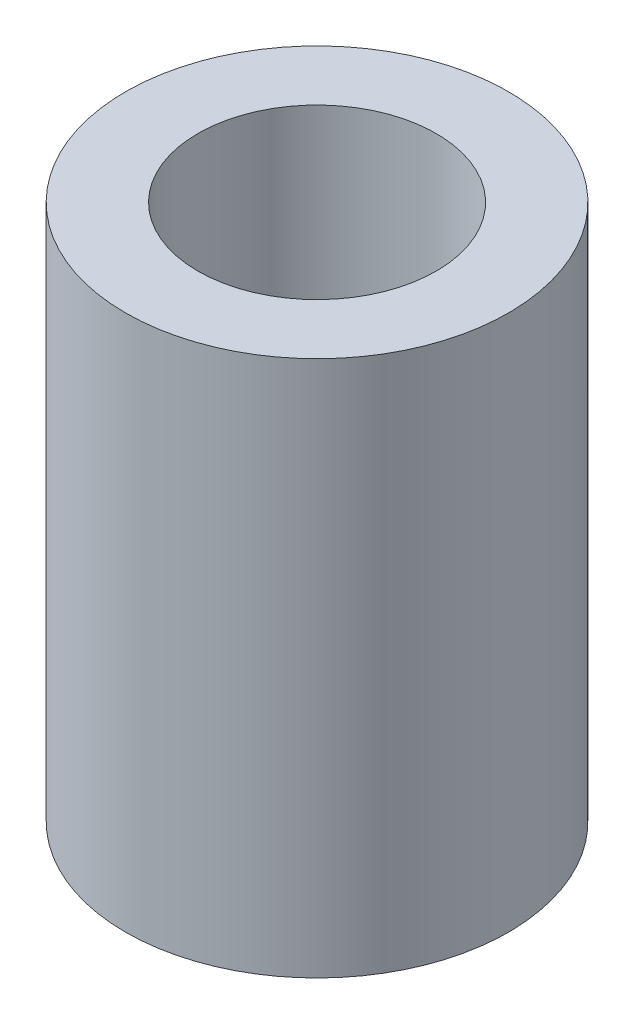
ISO-10303-21;
HEADER;
FILE_DESCRIPTION(('STEP AP214'),'2;1');
FILE_NAME('part.step','',(''),(''),'','','');
FILE_SCHEMA(('AUTOMOTIVE_DESIGN { 1 0 10303 214 1 1 1 1 }'));
ENDSEC;
DATA;
#1=APPLICATION_CONTEXT('core data for automotive mechanical design processes');
#2=APPLICATION_PROTOCOL_DEFINITION('international standard','automotive_design',2000,#1);
#3=PRODUCT_CONTEXT('',#1,'mechanical');
#4=PRODUCT('Part','Part','',(#3));
#5=PRODUCT_RELATED_PRODUCT_CATEGORY('part','',(#4));
#6=PRODUCT_DEFINITION_FORMATION('','',#4);
#7=PRODUCT_DEFINITION_CONTEXT('part definition',#1,'design');
#8=PRODUCT_DEFINITION('design','',#6,#7);
#9=PRODUCT_DEFINITION_SHAPE('','',#8);
#10=(LENGTH_UNIT() NAMED_UNIT(*) SI_UNIT(.MILLI.,.METRE.));
#11=(NAMED_UNIT(*) PLANE_ANGLE_UNIT() SI_UNIT($,.RADIAN.));
#12=(NAMED_UNIT(*) SI_UNIT($,.STERADIAN.) SOLID_ANGLE_UNIT());
#13=UNCERTAINTY_MEASURE_WITH_UNIT(LENGTH_MEASURE(1.E-05),#10,'distance_accuracy_value','');
#14=(GEOMETRIC_REPRESENTATION_CONTEXT(3) GLOBAL_UNCERTAINTY_ASSIGNED_CONTEXT((#13)) GLOBAL_UNIT_ASSIGNED_CONTEXT((#10,
#11,#12)) REPRESENTATION_CONTEXT('',''));
#15=CARTESIAN_POINT('',(0.,0.,0.));
#16=DIRECTION('',(0.,0.,1.));
#17=DIRECTION('',(1.,0.,0.));
#18=AXIS2_PLACEMENT_3D('',#15,#16,#17);
#19=CARTESIAN_POINT('',(0.,6.3,0.));
#20=DIRECTION('',(0.,-1.,0.));
#21=DIRECTION('',(0.,0.,-1.));
#22=AXIS2_PLACEMENT_3D('',#19,#20,#21);
#23=CYLINDRICAL_SURFACE('',#22,2.25);
#24=CARTESIAN_POINT('',(0.,6.3,0.));
#25=DIRECTION('',(0.,1.,0.));
#26=DIRECTION('',(0.,0.,1.));
#27=AXIS2_PLACEMENT_3D('',#24,#25,#26);
#28=CIRCLE('',#27,2.25);
#29=CARTESIAN_POINT('',(0.,6.3,2.25));
#30=VERTEX_POINT('',#29);
#31=EDGE_CURVE('E10',#30,#30,#28,.T.);
#32=ORIENTED_EDGE('',*,*,#31,.F.);
#33=EDGE_LOOP('',(#32));
#34=FACE_BOUND('',#33,.T.);
#35=CARTESIAN_POINT('',(0.,0.,0.));
#36=DIRECTION('',(0.,1.,0.));
#37=DIRECTION('',(0.,0.,1.));
#38=AXIS2_PLACEMENT_3D('',#35,#36,#37);
#39=CIRCLE('',#38,2.25);
#40=CARTESIAN_POINT('',(0.,0.,2.25));
#41=VERTEX_POINT('',#40);
#42=EDGE_CURVE('E32',#41,#41,#39,.T.);
#43=ORIENTED_EDGE('',*,*,#42,.T.);
#44=EDGE_LOOP('',(#43));
#45=FACE_BOUND('',#44,.T.);
#46=ADVANCED_FACE('F29',(#34,#45),#23,.T.);
#47=CARTESIAN_POINT('',(0.,6.3,0.));
#48=DIRECTION('',(0.,1.,0.));
#49=DIRECTION('',(0.,0.,1.));
#50=AXIS2_PLACEMENT_3D('',#47,#48,#49);
#51=PLANE('',#50);
#52=CARTESIAN_POINT('',(0.,6.3,0.));
#53=DIRECTION('',(0.,1.,0.));
#54=DIRECTION('',(0.,0.,1.));
#55=AXIS2_PLACEMENT_3D('',#52,#53,#54);
#56=CIRCLE('',#55,1.4);
#57=CARTESIAN_POINT('',(0.,6.3,1.4));
#58=VERTEX_POINT('',#57);
#59=EDGE_CURVE('E41',#58,#58,#56,.T.);
#60=ORIENTED_EDGE('',*,*,#59,.F.);
#61=EDGE_LOOP('',(#60));
#62=FACE_BOUND('',#61,.T.);
#63=ORIENTED_EDGE('',*,*,#31,.T.);
#64=EDGE_LOOP('',(#63));
#65=FACE_BOUND('',#64,.T.);
#66=ADVANCED_FACE('F56',(#62,#65),#51,.T.);
#67=CARTESIAN_POINT('',(0.,0.,0.));
#68=DIRECTION('',(0.,1.,0.));
#69=DIRECTION('',(0.,0.,1.));
#70=AXIS2_PLACEMENT_3D('',#67,#68,#69);
#71=PLANE('',#70);
#72=ORIENTED_EDGE('',*,*,#42,.F.);
#73=EDGE_LOOP('',(#72));
#74=FACE_BOUND('',#73,.T.);
#75=ADVANCED_FACE('F52',(#74),#71,.F.);
#76=CARTESIAN_POINT('',(0.,3.,0.));
#77=DIRECTION('',(0.,1.,0.));
#78=DIRECTION('',(0.,0.,1.));
#79=AXIS2_PLACEMENT_3D('',#76,#77,#78);
#80=CYLINDRICAL_SURFACE('',#79,1.4);
#81=CARTESIAN_POINT('',(0.,3.,0.));
#82=DIRECTION('',(0.,1.,0.));
#83=DIRECTION('',(0.,0.,1.));
#84=AXIS2_PLACEMENT_3D('',#81,#82,#83);
#85=CIRCLE('',#84,1.4);
#86=CARTESIAN_POINT('',(0.,3.,1.4));
#87=VERTEX_POINT('',#86);
#88=EDGE_CURVE('E39',#87,#87,#85,.T.);
#89=ORIENTED_EDGE('',*,*,#88,.F.);
#90=EDGE_LOOP('',(#89));
#91=FACE_BOUND('',#90,.T.);
#92=ORIENTED_EDGE('',*,*,#59,.T.);
#93=EDGE_LOOP('',(#92));
#94=FACE_BOUND('',#93,.T.);
#95=ADVANCED_FACE('F49',(#91,#94),#80,.F.);
#96=CARTESIAN_POINT('',(0.,3.,0.));
#97=DIRECTION('',(0.,1.,0.));
#98=DIRECTION('',(0.,0.,1.));
#99=AXIS2_PLACEMENT_3D('',#96,#97,#98);
#100=PLANE('',#99);
#101=ORIENTED_EDGE('',*,*,#88,.T.);
#102=EDGE_LOOP('',(#101));
#103=FACE_BOUND('',#102,.T.);
#104=ADVANCED_FACE('F47',(#103),#100,.T.);
#105=CLOSED_SHELL('',(#46,#66,#75,#95,#104));
#106=MANIFOLD_SOLID_BREP('B2',#105);
#107=ADVANCED_BREP_SHAPE_REPRESENTATION('',(#18,#106),#14);
#108=SHAPE_DEFINITION_REPRESENTATION(#9,#107);
ENDSEC;
END-ISO-10303-21;
